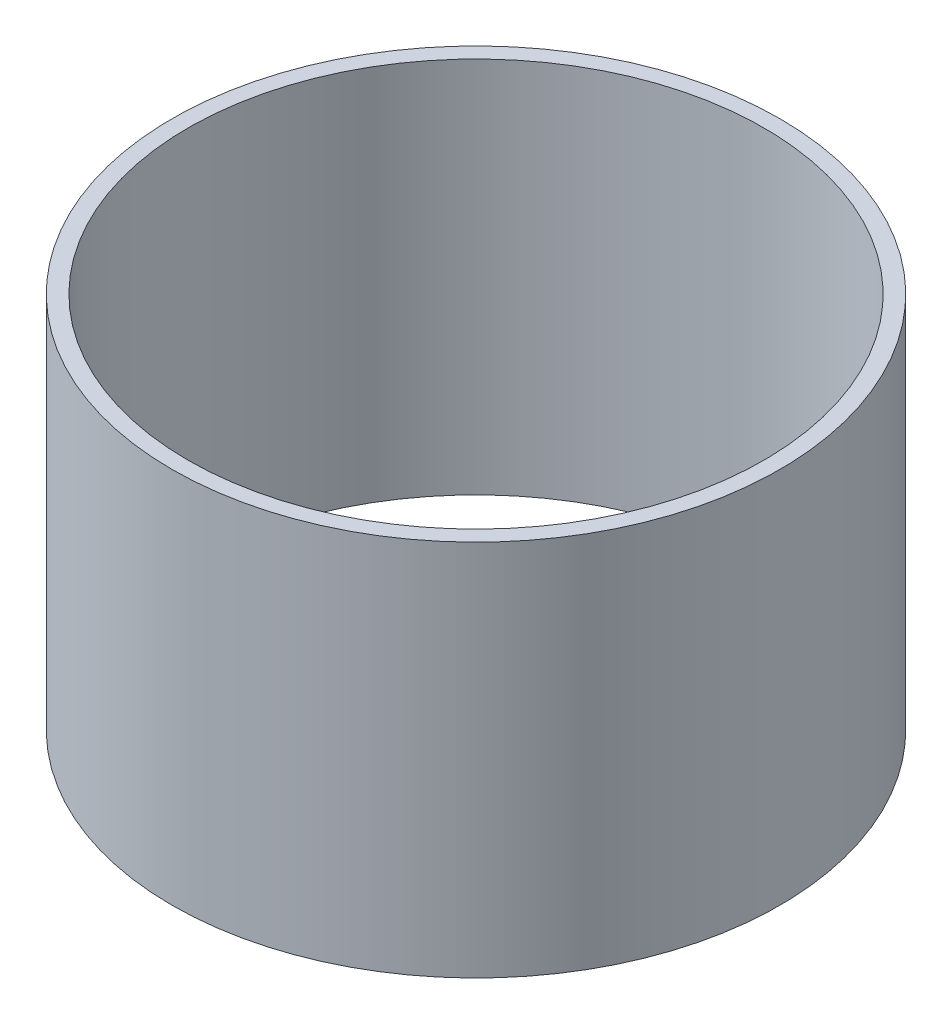
ISO-10303-21;
HEADER;
FILE_DESCRIPTION(('STEP AP214'),'2;1');
FILE_NAME('part.step','',(''),(''),'','','');
FILE_SCHEMA(('AUTOMOTIVE_DESIGN { 1 0 10303 214 1 1 1 1 }'));
ENDSEC;
DATA;
#1=APPLICATION_CONTEXT('core data for automotive mechanical design processes');
#2=APPLICATION_PROTOCOL_DEFINITION('international standard','automotive_design',2000,#1);
#3=PRODUCT_CONTEXT('',#1,'mechanical');
#4=PRODUCT('Part','Part','',(#3));
#5=PRODUCT_RELATED_PRODUCT_CATEGORY('part','',(#4));
#6=PRODUCT_DEFINITION_FORMATION('','',#4);
#7=PRODUCT_DEFINITION_CONTEXT('part definition',#1,'design');
#8=PRODUCT_DEFINITION('design','',#6,#7);
#9=PRODUCT_DEFINITION_SHAPE('','',#8);
#10=(LENGTH_UNIT() NAMED_UNIT(*) SI_UNIT(.MILLI.,.METRE.));
#11=(NAMED_UNIT(*) PLANE_ANGLE_UNIT() SI_UNIT($,.RADIAN.));
#12=(NAMED_UNIT(*) SI_UNIT($,.STERADIAN.) SOLID_ANGLE_UNIT());
#13=UNCERTAINTY_MEASURE_WITH_UNIT(LENGTH_MEASURE(1.E-05),#10,'distance_accuracy_value','');
#14=(GEOMETRIC_REPRESENTATION_CONTEXT(3) GLOBAL_UNCERTAINTY_ASSIGNED_CONTEXT((#13)) GLOBAL_UNIT_ASSIGNED_CONTEXT((#10,
#11,#12)) REPRESENTATION_CONTEXT('',''));
#15=CARTESIAN_POINT('',(0.,0.,0.));
#16=DIRECTION('',(0.,0.,1.));
#17=DIRECTION('',(1.,0.,0.));
#18=AXIS2_PLACEMENT_3D('',#15,#16,#17);
#19=CARTESIAN_POINT('',(0.,30.,0.));
#20=DIRECTION('',(0.,1.,0.));
#21=DIRECTION('',(0.,0.,1.));
#22=AXIS2_PLACEMENT_3D('',#19,#20,#21);
#23=PLANE('',#22);
#24=CARTESIAN_POINT('',(0.,30.,0.));
#25=DIRECTION('',(0.,1.,0.));
#26=DIRECTION('',(0.,0.,1.));
#27=AXIS2_PLACEMENT_3D('',#24,#25,#26);
#28=CIRCLE('',#27,24.15);
#29=CARTESIAN_POINT('',(0.,30.,24.15));
#30=VERTEX_POINT('',#29);
#31=EDGE_CURVE('E10',#30,#30,#28,.T.);
#32=ORIENTED_EDGE('',*,*,#31,.T.);
#33=EDGE_LOOP('',(#32));
#34=FACE_BOUND('',#33,.T.);
#35=CARTESIAN_POINT('',(0.,30.,0.));
#36=DIRECTION('',(0.,1.,0.));
#37=DIRECTION('',(0.,0.,1.));
#38=AXIS2_PLACEMENT_3D('',#35,#36,#37);
#39=CIRCLE('',#38,22.88);
#40=CARTESIAN_POINT('',(0.,30.,22.88));
#41=VERTEX_POINT('',#40);
#42=EDGE_CURVE('E50',#41,#41,#39,.T.);
#43=ORIENTED_EDGE('',*,*,#42,.F.);
#44=EDGE_LOOP('',(#43));
#45=FACE_BOUND('',#44,.T.);
#46=ADVANCED_FACE('F37',(#34,#45),#23,.T.);
#47=CARTESIAN_POINT('',(0.,0.,0.));
#48=DIRECTION('',(0.,1.,0.));
#49=DIRECTION('',(0.,0.,1.));
#50=AXIS2_PLACEMENT_3D('',#47,#48,#49);
#51=PLANE('',#50);
#52=CARTESIAN_POINT('',(0.,0.,0.));
#53=DIRECTION('',(0.,1.,0.));
#54=DIRECTION('',(0.,0.,1.));
#55=AXIS2_PLACEMENT_3D('',#52,#53,#54);
#56=CIRCLE('',#55,24.15);
#57=CARTESIAN_POINT('',(0.,0.,24.15));
#58=VERTEX_POINT('',#57);
#59=EDGE_CURVE('E41',#58,#58,#56,.T.);
#60=ORIENTED_EDGE('',*,*,#59,.F.);
#61=EDGE_LOOP('',(#60));
#62=FACE_BOUND('',#61,.T.);
#63=CARTESIAN_POINT('',(0.,0.,0.));
#64=DIRECTION('',(0.,1.,0.));
#65=DIRECTION('',(0.,0.,1.));
#66=AXIS2_PLACEMENT_3D('',#63,#64,#65);
#67=CIRCLE('',#66,22.88);
#68=CARTESIAN_POINT('',(0.,0.,22.88));
#69=VERTEX_POINT('',#68);
#70=EDGE_CURVE('E52',#69,#69,#67,.T.);
#71=ORIENTED_EDGE('',*,*,#70,.T.);
#72=EDGE_LOOP('',(#71));
#73=FACE_BOUND('',#72,.T.);
#74=ADVANCED_FACE('F64',(#62,#73),#51,.F.);
#75=CARTESIAN_POINT('',(0.,30.,0.));
#76=DIRECTION('',(0.,-1.,0.));
#77=DIRECTION('',(0.,0.,-1.));
#78=AXIS2_PLACEMENT_3D('',#75,#76,#77);
#79=CYLINDRICAL_SURFACE('',#78,24.15);
#80=ORIENTED_EDGE('',*,*,#31,.F.);
#81=EDGE_LOOP('',(#80));
#82=FACE_BOUND('',#81,.T.);
#83=ORIENTED_EDGE('',*,*,#59,.T.);
#84=EDGE_LOOP('',(#83));
#85=FACE_BOUND('',#84,.T.);
#86=ADVANCED_FACE('F39',(#82,#85),#79,.T.);
#87=CARTESIAN_POINT('',(0.,30.,0.));
#88=DIRECTION('',(0.,-1.,0.));
#89=DIRECTION('',(0.,0.,-1.));
#90=AXIS2_PLACEMENT_3D('',#87,#88,#89);
#91=CYLINDRICAL_SURFACE('',#90,22.88);
#92=ORIENTED_EDGE('',*,*,#42,.T.);
#93=EDGE_LOOP('',(#92));
#94=FACE_BOUND('',#93,.T.);
#95=ORIENTED_EDGE('',*,*,#70,.F.);
#96=EDGE_LOOP('',(#95));
#97=FACE_BOUND('',#96,.T.);
#98=ADVANCED_FACE('F60',(#94,#97),#91,.F.);
#99=CLOSED_SHELL('',(#46,#74,#86,#98));
#100=MANIFOLD_SOLID_BREP('B2',#99);
#101=ADVANCED_BREP_SHAPE_REPRESENTATION('',(#18,#100),#14);
#102=SHAPE_DEFINITION_REPRESENTATION(#9,#101);
ENDSEC;
END-ISO-10303-21;
